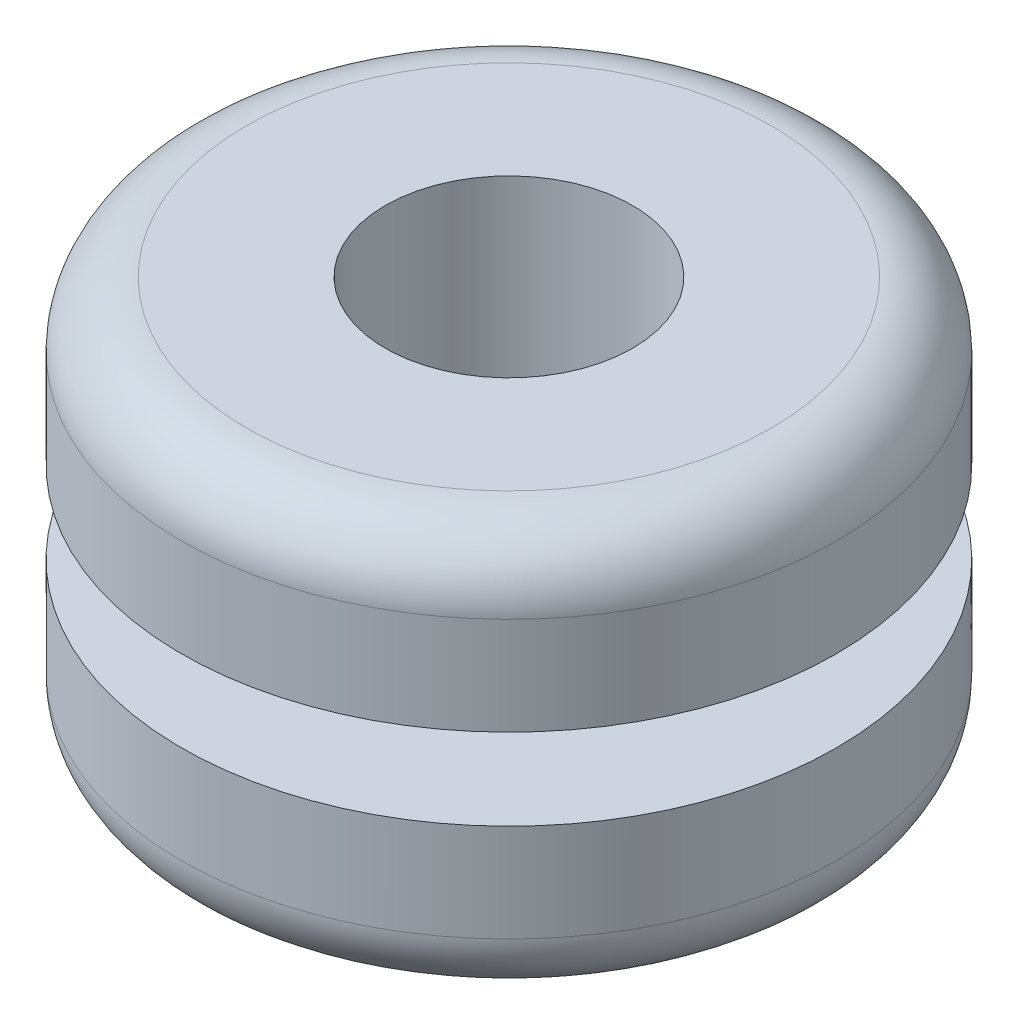
ISO-10303-21;
HEADER;
FILE_DESCRIPTION(('STEP AP214'),'2;1');
FILE_NAME('part.step','',(''),(''),'','','');
FILE_SCHEMA(('AUTOMOTIVE_DESIGN { 1 0 10303 214 1 1 1 1 }'));
ENDSEC;
DATA;
#1=APPLICATION_CONTEXT('core data for automotive mechanical design processes');
#2=APPLICATION_PROTOCOL_DEFINITION('international standard','automotive_design',2000,#1);
#3=PRODUCT_CONTEXT('',#1,'mechanical');
#4=PRODUCT('Part','Part','',(#3));
#5=PRODUCT_RELATED_PRODUCT_CATEGORY('part','',(#4));
#6=PRODUCT_DEFINITION_FORMATION('','',#4);
#7=PRODUCT_DEFINITION_CONTEXT('part definition',#1,'design');
#8=PRODUCT_DEFINITION('design','',#6,#7);
#9=PRODUCT_DEFINITION_SHAPE('','',#8);
#10=(LENGTH_UNIT() NAMED_UNIT(*) SI_UNIT(.MILLI.,.METRE.));
#11=(NAMED_UNIT(*) PLANE_ANGLE_UNIT() SI_UNIT($,.RADIAN.));
#12=(NAMED_UNIT(*) SI_UNIT($,.STERADIAN.) SOLID_ANGLE_UNIT());
#13=UNCERTAINTY_MEASURE_WITH_UNIT(LENGTH_MEASURE(1.E-05),#10,'distance_accuracy_value','');
#14=(GEOMETRIC_REPRESENTATION_CONTEXT(3) GLOBAL_UNCERTAINTY_ASSIGNED_CONTEXT((#13)) GLOBAL_UNIT_ASSIGNED_CONTEXT((#10,
#11,#12)) REPRESENTATION_CONTEXT('',''));
#15=CARTESIAN_POINT('',(0.,0.,0.));
#16=DIRECTION('',(0.,0.,1.));
#17=DIRECTION('',(1.,0.,0.));
#18=AXIS2_PLACEMENT_3D('',#15,#16,#17);
#19=CARTESIAN_POINT('',(0.992428643440547,-34.925,10.9046893186508));
#20=DIRECTION('',(0.,-1.,0.));
#21=DIRECTION('',(0.,0.,-1.));
#22=AXIS2_PLACEMENT_3D('',#19,#20,#21);
#23=PLANE('',#22);
#24=CARTESIAN_POINT('',(0.992428643440547,-34.925,7.14375));
#25=DIRECTION('',(0.,-1.,0.));
#26=DIRECTION('',(0.,0.,-1.));
#27=AXIS2_PLACEMENT_3D('',#24,#25,#26);
#28=CIRCLE('',#27,5.11031431865085);
#29=CARTESIAN_POINT('',(0.992428643440547,-34.925,2.03343568134915));
#30=VERTEX_POINT('',#29);
#31=EDGE_CURVE('E19',#30,#30,#28,.F.);
#32=ORIENTED_EDGE('',*,*,#31,.F.);
#33=EDGE_LOOP('',(#32));
#34=FACE_BOUND('',#33,.T.);
#35=CARTESIAN_POINT('',(0.992428643440548,-34.925,7.14375));
#36=DIRECTION('',(0.,-1.,0.));
#37=DIRECTION('',(1.,0.,0.));
#38=AXIS2_PLACEMENT_3D('',#35,#36,#37);
#39=CIRCLE('',#38,2.41156431865085);
#40=CARTESIAN_POINT('',(3.40399296209139,-34.925,7.14375));
#41=VERTEX_POINT('',#40);
#42=EDGE_CURVE('E45',#41,#41,#39,.F.);
#43=ORIENTED_EDGE('',*,*,#42,.T.);
#44=EDGE_LOOP('',(#43));
#45=FACE_BOUND('',#44,.T.);
#46=ADVANCED_FACE('F15',(#34,#45),#23,.T.);
#47=CARTESIAN_POINT('',(0.992428643440547,-33.655,7.14375));
#48=DIRECTION('',(0.,-1.,0.));
#49=DIRECTION('',(0.,0.,-1.));
#50=AXIS2_PLACEMENT_3D('',#47,#48,#49);
#51=TOROIDAL_SURFACE('',#50,5.11031431865083,1.27000000000001);
#52=CARTESIAN_POINT('',(0.992428643440547,-33.655,7.14375));
#53=DIRECTION('',(0.,-1.,0.));
#54=DIRECTION('',(1.,0.,0.));
#55=AXIS2_PLACEMENT_3D('',#52,#53,#54);
#56=CIRCLE('',#55,6.38031431865085);
#57=CARTESIAN_POINT('',(7.37274296209139,-33.655,7.14375));
#58=VERTEX_POINT('',#57);
#59=EDGE_CURVE('E31',#58,#58,#56,.F.);
#60=ORIENTED_EDGE('',*,*,#59,.F.);
#61=EDGE_LOOP('',(#60));
#62=FACE_BOUND('',#61,.T.);
#63=ORIENTED_EDGE('',*,*,#31,.T.);
#64=EDGE_LOOP('',(#63));
#65=FACE_BOUND('',#64,.T.);
#66=ADVANCED_FACE('F53',(#62,#65),#51,.T.);
#67=CARTESIAN_POINT('',(0.992428643440547,-30.95625,7.14375));
#68=DIRECTION('',(0.,-1.,0.));
#69=DIRECTION('',(1.,0.,0.));
#70=AXIS2_PLACEMENT_3D('',#67,#68,#69);
#71=CYLINDRICAL_SURFACE('',#70,2.41156431865085);
#72=ORIENTED_EDGE('',*,*,#42,.F.);
#73=EDGE_LOOP('',(#72));
#74=FACE_BOUND('',#73,.T.);
#75=CARTESIAN_POINT('',(0.992428643440546,-26.9875,7.14375));
#76=DIRECTION('',(0.,-1.,0.));
#77=DIRECTION('',(1.,0.,0.));
#78=AXIS2_PLACEMENT_3D('',#75,#76,#77);
#79=CIRCLE('',#78,2.41156431865085);
#80=CARTESIAN_POINT('',(3.40399296209139,-26.9875,7.14375));
#81=VERTEX_POINT('',#80);
#82=EDGE_CURVE('E43',#81,#81,#79,.T.);
#83=ORIENTED_EDGE('',*,*,#82,.F.);
#84=EDGE_LOOP('',(#83));
#85=FACE_BOUND('',#84,.T.);
#86=ADVANCED_FACE('F61',(#74,#85),#71,.F.);
#87=CARTESIAN_POINT('',(0.992428643440547,-32.7025,7.14375));
#88=DIRECTION('',(0.,-1.,0.));
#89=DIRECTION('',(1.,0.,0.));
#90=AXIS2_PLACEMENT_3D('',#87,#88,#89);
#91=CYLINDRICAL_SURFACE('',#90,6.38031431865085);
#92=CARTESIAN_POINT('',(0.992428643440547,-31.75,7.14375));
#93=DIRECTION('',(0.,-1.,0.));
#94=DIRECTION('',(1.,0.,0.));
#95=AXIS2_PLACEMENT_3D('',#92,#93,#94);
#96=CIRCLE('',#95,6.38031431865085);
#97=CARTESIAN_POINT('',(7.37274296209139,-31.75,7.14375));
#98=VERTEX_POINT('',#97);
#99=EDGE_CURVE('E40',#98,#98,#96,.F.);
#100=ORIENTED_EDGE('',*,*,#99,.F.);
#101=EDGE_LOOP('',(#100));
#102=FACE_BOUND('',#101,.T.);
#103=ORIENTED_EDGE('',*,*,#59,.T.);
#104=EDGE_LOOP('',(#103));
#105=FACE_BOUND('',#104,.T.);
#106=ADVANCED_FACE('F86',(#102,#105),#91,.T.);
#107=CARTESIAN_POINT('',(0.992428643440547,-26.9875,10.9046893186508));
#108=DIRECTION('',(0.,1.,0.));
#109=DIRECTION('',(0.,0.,1.));
#110=AXIS2_PLACEMENT_3D('',#107,#108,#109);
#111=PLANE('',#110);
#112=CARTESIAN_POINT('',(0.992428643440547,-26.9875,7.14375));
#113=DIRECTION('',(0.,-1.,0.));
#114=DIRECTION('',(1.,0.,0.));
#115=AXIS2_PLACEMENT_3D('',#112,#113,#114);
#116=CIRCLE('',#115,5.11031431865085);
#117=CARTESIAN_POINT('',(6.1027429620914,-26.9875,7.14375));
#118=VERTEX_POINT('',#117);
#119=EDGE_CURVE('E37',#118,#118,#116,.T.);
#120=ORIENTED_EDGE('',*,*,#119,.F.);
#121=EDGE_LOOP('',(#120));
#122=FACE_BOUND('',#121,.T.);
#123=ORIENTED_EDGE('',*,*,#82,.T.);
#124=EDGE_LOOP('',(#123));
#125=FACE_BOUND('',#124,.T.);
#126=ADVANCED_FACE('F82',(#122,#125),#111,.T.);
#127=CARTESIAN_POINT('',(0.992428643440547,-31.75,12.0071321593254));
#128=DIRECTION('',(0.,1.,0.));
#129=DIRECTION('',(0.,0.,1.));
#130=AXIS2_PLACEMENT_3D('',#127,#128,#129);
#131=PLANE('',#130);
#132=ORIENTED_EDGE('',*,*,#99,.T.);
#133=EDGE_LOOP('',(#132));
#134=FACE_BOUND('',#133,.T.);
#135=CARTESIAN_POINT('',(0.992428643440547,-31.75,7.14375));
#136=DIRECTION('',(0.,-1.,0.));
#137=DIRECTION('',(1.,0.,0.));
#138=AXIS2_PLACEMENT_3D('',#135,#136,#137);
#139=CIRCLE('',#138,3.34645);
#140=CARTESIAN_POINT('',(4.33887864344055,-31.75,7.14375));
#141=VERTEX_POINT('',#140);
#142=EDGE_CURVE('E34',#141,#141,#139,.F.);
#143=ORIENTED_EDGE('',*,*,#142,.F.);
#144=EDGE_LOOP('',(#143));
#145=FACE_BOUND('',#144,.T.);
#146=ADVANCED_FACE('F79',(#134,#145),#131,.T.);
#147=CARTESIAN_POINT('',(0.992428643440547,-28.2575,7.14375));
#148=DIRECTION('',(0.,-1.,0.));
#149=DIRECTION('',(1.,0.,0.));
#150=AXIS2_PLACEMENT_3D('',#147,#148,#149);
#151=TOROIDAL_SURFACE('',#150,5.11031431865084,1.27);
#152=CARTESIAN_POINT('',(0.992428643440547,-28.2575,7.14375));
#153=DIRECTION('',(0.,-1.,0.));
#154=DIRECTION('',(1.,0.,0.));
#155=AXIS2_PLACEMENT_3D('',#152,#153,#154);
#156=CIRCLE('',#155,6.38031431865085);
#157=CARTESIAN_POINT('',(7.37274296209139,-28.2575,7.14375));
#158=VERTEX_POINT('',#157);
#159=EDGE_CURVE('E28',#158,#158,#156,.T.);
#160=ORIENTED_EDGE('',*,*,#159,.F.);
#161=EDGE_LOOP('',(#160));
#162=FACE_BOUND('',#161,.T.);
#163=ORIENTED_EDGE('',*,*,#119,.T.);
#164=EDGE_LOOP('',(#163));
#165=FACE_BOUND('',#164,.T.);
#166=ADVANCED_FACE('F17',(#162,#165),#151,.T.);
#167=CARTESIAN_POINT('',(0.992428643440547,-30.95625,7.14375));
#168=DIRECTION('',(0.,-1.,0.));
#169=DIRECTION('',(1.,0.,0.));
#170=AXIS2_PLACEMENT_3D('',#167,#168,#169);
#171=CYLINDRICAL_SURFACE('',#170,3.34645);
#172=ORIENTED_EDGE('',*,*,#142,.T.);
#173=EDGE_LOOP('',(#172));
#174=FACE_BOUND('',#173,.T.);
#175=CARTESIAN_POINT('',(0.992428643440547,-30.1625,7.14375));
#176=DIRECTION('',(0.,-1.,0.));
#177=DIRECTION('',(1.,0.,0.));
#178=AXIS2_PLACEMENT_3D('',#175,#176,#177);
#179=CIRCLE('',#178,3.34645);
#180=CARTESIAN_POINT('',(4.33887864344055,-30.1625,7.14375));
#181=VERTEX_POINT('',#180);
#182=EDGE_CURVE('E23',#181,#181,#179,.F.);
#183=ORIENTED_EDGE('',*,*,#182,.F.);
#184=EDGE_LOOP('',(#183));
#185=FACE_BOUND('',#184,.T.);
#186=ADVANCED_FACE('F71',(#174,#185),#171,.T.);
#187=CARTESIAN_POINT('',(0.992428643440547,-29.21,7.14375));
#188=DIRECTION('',(0.,-1.,0.));
#189=DIRECTION('',(1.,0.,0.));
#190=AXIS2_PLACEMENT_3D('',#187,#188,#189);
#191=CYLINDRICAL_SURFACE('',#190,6.38031431865085);
#192=CARTESIAN_POINT('',(0.992428643440547,-30.1625,7.14375));
#193=DIRECTION('',(0.,-1.,0.));
#194=DIRECTION('',(1.,0.,0.));
#195=AXIS2_PLACEMENT_3D('',#192,#193,#194);
#196=CIRCLE('',#195,6.38031431865085);
#197=CARTESIAN_POINT('',(7.37274296209139,-30.1625,7.14375));
#198=VERTEX_POINT('',#197);
#199=EDGE_CURVE('E10',#198,#198,#196,.T.);
#200=ORIENTED_EDGE('',*,*,#199,.F.);
#201=EDGE_LOOP('',(#200));
#202=FACE_BOUND('',#201,.T.);
#203=ORIENTED_EDGE('',*,*,#159,.T.);
#204=EDGE_LOOP('',(#203));
#205=FACE_BOUND('',#204,.T.);
#206=ADVANCED_FACE('F66',(#202,#205),#191,.T.);
#207=CARTESIAN_POINT('',(0.992428643440547,-30.1625,12.0071321593254));
#208=DIRECTION('',(0.,-1.,0.));
#209=DIRECTION('',(0.,0.,-1.));
#210=AXIS2_PLACEMENT_3D('',#207,#208,#209);
#211=PLANE('',#210);
#212=ORIENTED_EDGE('',*,*,#199,.T.);
#213=EDGE_LOOP('',(#212));
#214=FACE_BOUND('',#213,.T.);
#215=ORIENTED_EDGE('',*,*,#182,.T.);
#216=EDGE_LOOP('',(#215));
#217=FACE_BOUND('',#216,.T.);
#218=ADVANCED_FACE('F64',(#214,#217),#211,.T.);
#219=CLOSED_SHELL('',(#46,#66,#86,#106,#126,#146,#166,#186,#206,#218));
#220=MANIFOLD_SOLID_BREP('B1',#219);
#221=ADVANCED_BREP_SHAPE_REPRESENTATION('',(#18,#220),#14);
#222=SHAPE_DEFINITION_REPRESENTATION(#9,#221);
ENDSEC;
END-ISO-10303-21;
